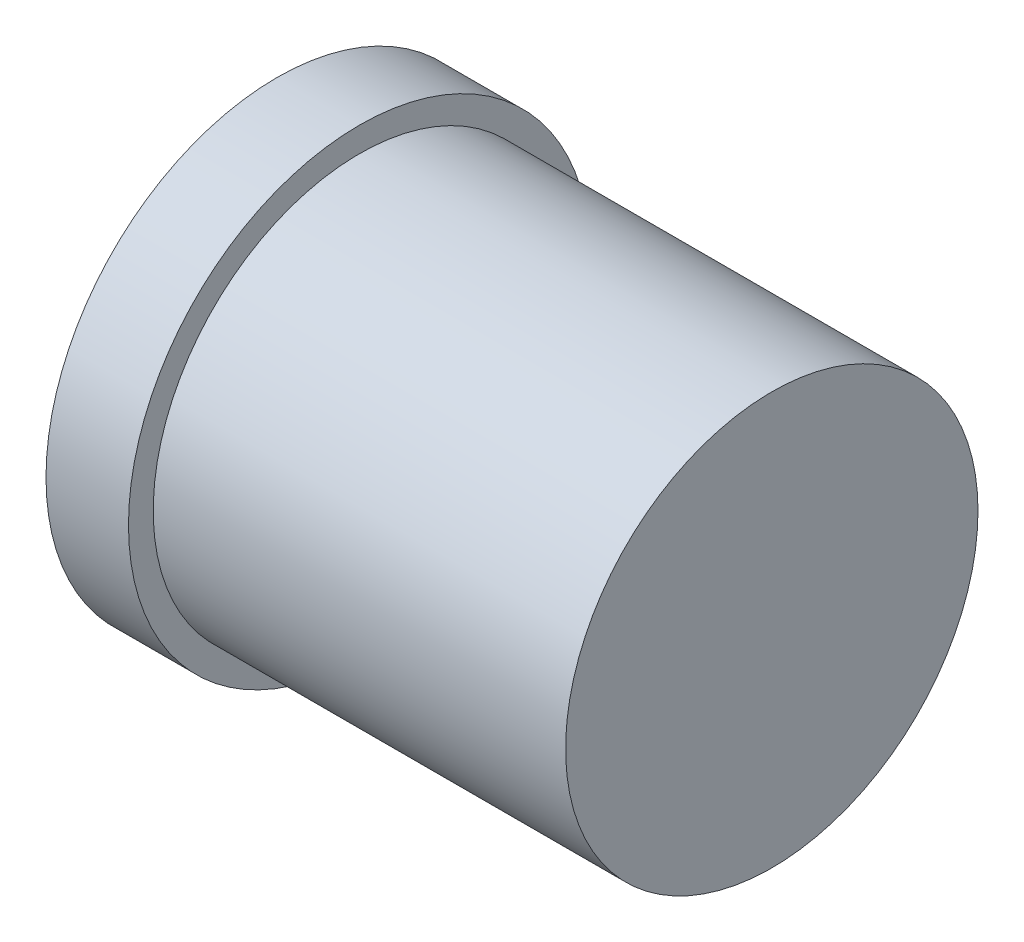
ISO-10303-21;
HEADER;
FILE_DESCRIPTION(('STEP AP214'),'2;1');
FILE_NAME('part.step','',(''),(''),'','','');
FILE_SCHEMA(('AUTOMOTIVE_DESIGN { 1 0 10303 214 1 1 1 1 }'));
ENDSEC;
DATA;
#1=APPLICATION_CONTEXT('core data for automotive mechanical design processes');
#2=APPLICATION_PROTOCOL_DEFINITION('international standard','automotive_design',2000,#1);
#3=PRODUCT_CONTEXT('',#1,'mechanical');
#4=PRODUCT('Part','Part','',(#3));
#5=PRODUCT_RELATED_PRODUCT_CATEGORY('part','',(#4));
#6=PRODUCT_DEFINITION_FORMATION('','',#4);
#7=PRODUCT_DEFINITION_CONTEXT('part definition',#1,'design');
#8=PRODUCT_DEFINITION('design','',#6,#7);
#9=PRODUCT_DEFINITION_SHAPE('','',#8);
#10=(LENGTH_UNIT() NAMED_UNIT(*) SI_UNIT(.MILLI.,.METRE.));
#11=(NAMED_UNIT(*) PLANE_ANGLE_UNIT() SI_UNIT($,.RADIAN.));
#12=(NAMED_UNIT(*) SI_UNIT($,.STERADIAN.) SOLID_ANGLE_UNIT());
#13=UNCERTAINTY_MEASURE_WITH_UNIT(LENGTH_MEASURE(1.E-05),#10,'distance_accuracy_value','');
#14=(GEOMETRIC_REPRESENTATION_CONTEXT(3) GLOBAL_UNCERTAINTY_ASSIGNED_CONTEXT((#13)) GLOBAL_UNIT_ASSIGNED_CONTEXT((#10,
#11,#12)) REPRESENTATION_CONTEXT('',''));
#15=CARTESIAN_POINT('',(0.,0.,0.));
#16=DIRECTION('',(0.,0.,1.));
#17=DIRECTION('',(1.,0.,0.));
#18=AXIS2_PLACEMENT_3D('',#15,#16,#17);
#19=CARTESIAN_POINT('',(5.,0.,0.));
#20=DIRECTION('',(-1.,0.,0.));
#21=DIRECTION('',(0.,0.,1.));
#22=AXIS2_PLACEMENT_3D('',#19,#20,#21);
#23=CYLINDRICAL_SURFACE('',#22,14.);
#24=CARTESIAN_POINT('',(5.,0.,0.));
#25=DIRECTION('',(1.,0.,0.));
#26=DIRECTION('',(0.,0.,-1.));
#27=AXIS2_PLACEMENT_3D('',#24,#25,#26);
#28=CIRCLE('',#27,14.);
#29=CARTESIAN_POINT('',(5.,0.,-14.));
#30=VERTEX_POINT('',#29);
#31=EDGE_CURVE('E46',#30,#30,#28,.T.);
#32=ORIENTED_EDGE('',*,*,#31,.F.);
#33=EDGE_LOOP('',(#32));
#34=FACE_BOUND('',#33,.T.);
#35=CARTESIAN_POINT('',(0.,0.,0.));
#36=DIRECTION('',(1.,0.,0.));
#37=DIRECTION('',(0.,0.,-1.));
#38=AXIS2_PLACEMENT_3D('',#35,#36,#37);
#39=CIRCLE('',#38,14.);
#40=CARTESIAN_POINT('',(0.,0.,-14.));
#41=VERTEX_POINT('',#40);
#42=EDGE_CURVE('E42',#41,#41,#39,.T.);
#43=ORIENTED_EDGE('',*,*,#42,.T.);
#44=EDGE_LOOP('',(#43));
#45=FACE_BOUND('',#44,.T.);
#46=ADVANCED_FACE('F39',(#34,#45),#23,.T.);
#47=CARTESIAN_POINT('',(5.,0.,0.));
#48=DIRECTION('',(1.,0.,0.));
#49=DIRECTION('',(0.,0.,-1.));
#50=AXIS2_PLACEMENT_3D('',#47,#48,#49);
#51=PLANE('',#50);
#52=CARTESIAN_POINT('',(5.,0.,0.));
#53=DIRECTION('',(1.,0.,0.));
#54=DIRECTION('',(0.,0.,-1.));
#55=AXIS2_PLACEMENT_3D('',#52,#53,#54);
#56=CIRCLE('',#55,12.5);
#57=CARTESIAN_POINT('',(5.,0.,-12.5));
#58=VERTEX_POINT('',#57);
#59=EDGE_CURVE('E10',#58,#58,#56,.T.);
#60=ORIENTED_EDGE('',*,*,#59,.F.);
#61=EDGE_LOOP('',(#60));
#62=FACE_BOUND('',#61,.T.);
#63=ORIENTED_EDGE('',*,*,#31,.T.);
#64=EDGE_LOOP('',(#63));
#65=FACE_BOUND('',#64,.T.);
#66=ADVANCED_FACE('F63',(#62,#65),#51,.T.);
#67=CARTESIAN_POINT('',(0.,0.,0.));
#68=DIRECTION('',(1.,0.,0.));
#69=DIRECTION('',(0.,0.,-1.));
#70=AXIS2_PLACEMENT_3D('',#67,#68,#69);
#71=PLANE('',#70);
#72=ORIENTED_EDGE('',*,*,#42,.F.);
#73=EDGE_LOOP('',(#72));
#74=FACE_BOUND('',#73,.T.);
#75=ADVANCED_FACE('F60',(#74),#71,.F.);
#76=CARTESIAN_POINT('',(30.,0.,0.));
#77=DIRECTION('',(-1.,0.,0.));
#78=DIRECTION('',(0.,0.,1.));
#79=AXIS2_PLACEMENT_3D('',#76,#77,#78);
#80=CYLINDRICAL_SURFACE('',#79,12.5);
#81=CARTESIAN_POINT('',(30.,0.,0.));
#82=DIRECTION('',(1.,0.,0.));
#83=DIRECTION('',(0.,0.,-1.));
#84=AXIS2_PLACEMENT_3D('',#81,#82,#83);
#85=CIRCLE('',#84,12.5);
#86=CARTESIAN_POINT('',(30.,0.,-12.5));
#87=VERTEX_POINT('',#86);
#88=EDGE_CURVE('E52',#87,#87,#85,.T.);
#89=ORIENTED_EDGE('',*,*,#88,.F.);
#90=EDGE_LOOP('',(#89));
#91=FACE_BOUND('',#90,.T.);
#92=ORIENTED_EDGE('',*,*,#59,.T.);
#93=EDGE_LOOP('',(#92));
#94=FACE_BOUND('',#93,.T.);
#95=ADVANCED_FACE('F62',(#91,#94),#80,.T.);
#96=CARTESIAN_POINT('',(30.,0.,0.));
#97=DIRECTION('',(1.,0.,0.));
#98=DIRECTION('',(0.,0.,-1.));
#99=AXIS2_PLACEMENT_3D('',#96,#97,#98);
#100=PLANE('',#99);
#101=ORIENTED_EDGE('',*,*,#88,.T.);
#102=EDGE_LOOP('',(#101));
#103=FACE_BOUND('',#102,.T.);
#104=ADVANCED_FACE('F69',(#103),#100,.T.);
#105=CLOSED_SHELL('',(#46,#66,#75,#95,#104));
#106=MANIFOLD_SOLID_BREP('B2',#105);
#107=ADVANCED_BREP_SHAPE_REPRESENTATION('',(#18,#106),#14);
#108=SHAPE_DEFINITION_REPRESENTATION(#9,#107);
ENDSEC;
END-ISO-10303-21;
